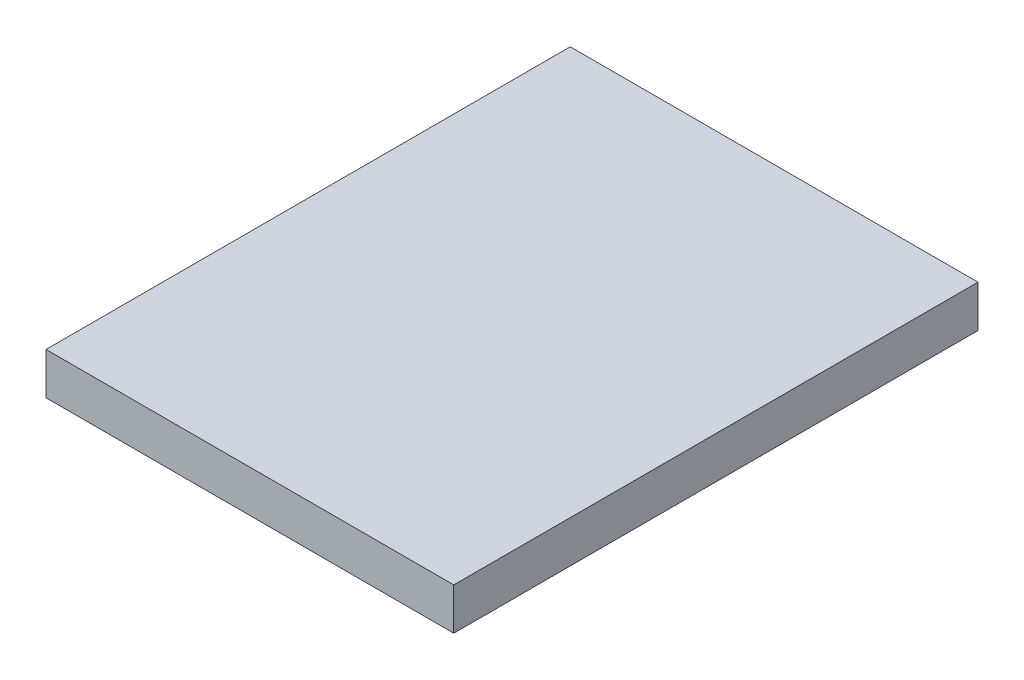
ISO-10303-21;
HEADER;
FILE_DESCRIPTION(('STEP AP214'),'2;1');
FILE_NAME('part.step','',(''),(''),'','','');
FILE_SCHEMA(('AUTOMOTIVE_DESIGN { 1 0 10303 214 1 1 1 1 }'));
ENDSEC;
DATA;
#1=APPLICATION_CONTEXT('core data for automotive mechanical design processes');
#2=APPLICATION_PROTOCOL_DEFINITION('international standard','automotive_design',2000,#1);
#3=PRODUCT_CONTEXT('',#1,'mechanical');
#4=PRODUCT('Part','Part','',(#3));
#5=PRODUCT_RELATED_PRODUCT_CATEGORY('part','',(#4));
#6=PRODUCT_DEFINITION_FORMATION('','',#4);
#7=PRODUCT_DEFINITION_CONTEXT('part definition',#1,'design');
#8=PRODUCT_DEFINITION('design','',#6,#7);
#9=PRODUCT_DEFINITION_SHAPE('','',#8);
#10=(LENGTH_UNIT() NAMED_UNIT(*) SI_UNIT(.MILLI.,.METRE.));
#11=(NAMED_UNIT(*) PLANE_ANGLE_UNIT() SI_UNIT($,.RADIAN.));
#12=(NAMED_UNIT(*) SI_UNIT($,.STERADIAN.) SOLID_ANGLE_UNIT());
#13=UNCERTAINTY_MEASURE_WITH_UNIT(LENGTH_MEASURE(1.E-05),#10,'distance_accuracy_value','');
#14=(GEOMETRIC_REPRESENTATION_CONTEXT(3) GLOBAL_UNCERTAINTY_ASSIGNED_CONTEXT((#13)) GLOBAL_UNIT_ASSIGNED_CONTEXT((#10,
#11,#12)) REPRESENTATION_CONTEXT('',''));
#15=CARTESIAN_POINT('',(0.,0.,0.));
#16=DIRECTION('',(0.,0.,1.));
#17=DIRECTION('',(1.,0.,0.));
#18=AXIS2_PLACEMENT_3D('',#15,#16,#17);
#19=CARTESIAN_POINT('',(-88.9,18.25625,-228.6));
#20=DIRECTION('',(1.,0.,0.));
#21=DIRECTION('',(0.,0.,-1.));
#22=AXIS2_PLACEMENT_3D('',#19,#20,#21);
#23=PLANE('',#22);
#24=DIRECTION('',(0.,0.,1.));
#25=VECTOR('',#24,1.);
#26=CARTESIAN_POINT('',(-88.9,0.,-228.6));
#27=LINE('',#26,#25);
#28=CARTESIAN_POINT('',(-88.9,0.,-228.6));
#29=VERTEX_POINT('',#28);
#30=CARTESIAN_POINT('',(-88.9,0.,0.));
#31=VERTEX_POINT('',#30);
#32=EDGE_CURVE('E96',#29,#31,#27,.T.);
#33=ORIENTED_EDGE('',*,*,#32,.T.);
#34=DIRECTION('',(0.,-1.,0.));
#35=VECTOR('',#34,1.);
#36=CARTESIAN_POINT('',(-88.9,18.25625,0.));
#37=LINE('',#36,#35);
#38=CARTESIAN_POINT('',(-88.9,18.25625,0.));
#39=VERTEX_POINT('',#38);
#40=EDGE_CURVE('E11',#39,#31,#37,.T.);
#41=ORIENTED_EDGE('',*,*,#40,.F.);
#42=DIRECTION('',(0.,0.,1.));
#43=VECTOR('',#42,1.);
#44=CARTESIAN_POINT('',(-88.9,18.25625,-228.6));
#45=LINE('',#44,#43);
#46=CARTESIAN_POINT('',(-88.9,18.25625,-228.6));
#47=VERTEX_POINT('',#46);
#48=EDGE_CURVE('E84',#47,#39,#45,.T.);
#49=ORIENTED_EDGE('',*,*,#48,.F.);
#50=DIRECTION('',(0.,-1.,0.));
#51=VECTOR('',#50,1.);
#52=CARTESIAN_POINT('',(-88.9,18.25625,-228.6));
#53=LINE('',#52,#51);
#54=EDGE_CURVE('E92',#47,#29,#53,.T.);
#55=ORIENTED_EDGE('',*,*,#54,.T.);
#56=EDGE_LOOP('',(#33,#41,#49,#55));
#57=FACE_BOUND('',#56,.T.);
#58=ADVANCED_FACE('F33',(#57),#23,.F.);
#59=CARTESIAN_POINT('',(-88.9,18.25625,0.));
#60=DIRECTION('',(0.,0.,-1.));
#61=DIRECTION('',(-1.,0.,0.));
#62=AXIS2_PLACEMENT_3D('',#59,#60,#61);
#63=PLANE('',#62);
#64=DIRECTION('',(1.,0.,0.));
#65=VECTOR('',#64,1.);
#66=CARTESIAN_POINT('',(-88.9,0.,0.));
#67=LINE('',#66,#65);
#68=CARTESIAN_POINT('',(88.9,0.,0.));
#69=VERTEX_POINT('',#68);
#70=EDGE_CURVE('E88',#31,#69,#67,.T.);
#71=ORIENTED_EDGE('',*,*,#70,.T.);
#72=DIRECTION('',(0.,-1.,0.));
#73=VECTOR('',#72,1.);
#74=CARTESIAN_POINT('',(88.9,18.25625,0.));
#75=LINE('',#74,#73);
#76=CARTESIAN_POINT('',(88.9,18.25625,0.));
#77=VERTEX_POINT('',#76);
#78=EDGE_CURVE('E41',#77,#69,#75,.T.);
#79=ORIENTED_EDGE('',*,*,#78,.F.);
#80=DIRECTION('',(1.,0.,0.));
#81=VECTOR('',#80,1.);
#82=CARTESIAN_POINT('',(-88.9,18.25625,0.));
#83=LINE('',#82,#81);
#84=EDGE_CURVE('E79',#39,#77,#83,.T.);
#85=ORIENTED_EDGE('',*,*,#84,.F.);
#86=ORIENTED_EDGE('',*,*,#40,.T.);
#87=EDGE_LOOP('',(#71,#79,#85,#86));
#88=FACE_BOUND('',#87,.T.);
#89=ADVANCED_FACE('F87',(#88),#63,.F.);
#90=CARTESIAN_POINT('',(88.8999999999999,18.25625,-228.6));
#91=DIRECTION('',(-1.,0.,0.));
#92=DIRECTION('',(0.,0.,1.));
#93=AXIS2_PLACEMENT_3D('',#90,#91,#92);
#94=PLANE('',#93);
#95=DIRECTION('',(0.,0.,-1.));
#96=VECTOR('',#95,1.);
#97=CARTESIAN_POINT('',(88.8999999999999,0.,-228.6));
#98=LINE('',#97,#96);
#99=CARTESIAN_POINT('',(88.8999999999999,0.,-228.6));
#100=VERTEX_POINT('',#99);
#101=EDGE_CURVE('E66',#69,#100,#98,.T.);
#102=ORIENTED_EDGE('',*,*,#101,.T.);
#103=DIRECTION('',(0.,-1.,0.));
#104=VECTOR('',#103,1.);
#105=CARTESIAN_POINT('',(88.8999999999999,18.25625,-228.6));
#106=LINE('',#105,#104);
#107=CARTESIAN_POINT('',(88.8999999999999,18.25625,-228.6));
#108=VERTEX_POINT('',#107);
#109=EDGE_CURVE('E89',#108,#100,#106,.T.);
#110=ORIENTED_EDGE('',*,*,#109,.F.);
#111=DIRECTION('',(0.,0.,-1.));
#112=VECTOR('',#111,1.);
#113=CARTESIAN_POINT('',(88.8999999999999,18.25625,-228.6));
#114=LINE('',#113,#112);
#115=EDGE_CURVE('E82',#77,#108,#114,.T.);
#116=ORIENTED_EDGE('',*,*,#115,.F.);
#117=ORIENTED_EDGE('',*,*,#78,.T.);
#118=EDGE_LOOP('',(#102,#110,#116,#117));
#119=FACE_BOUND('',#118,.T.);
#120=ADVANCED_FACE('F90',(#119),#94,.F.);
#121=CARTESIAN_POINT('',(-88.9,18.25625,-228.6));
#122=DIRECTION('',(0.,0.,1.));
#123=DIRECTION('',(1.,0.,0.));
#124=AXIS2_PLACEMENT_3D('',#121,#122,#123);
#125=PLANE('',#124);
#126=DIRECTION('',(-1.,0.,0.));
#127=VECTOR('',#126,1.);
#128=CARTESIAN_POINT('',(-88.9,0.,-228.6));
#129=LINE('',#128,#127);
#130=EDGE_CURVE('E72',#100,#29,#129,.T.);
#131=ORIENTED_EDGE('',*,*,#130,.T.);
#132=ORIENTED_EDGE('',*,*,#54,.F.);
#133=DIRECTION('',(-1.,0.,0.));
#134=VECTOR('',#133,1.);
#135=CARTESIAN_POINT('',(-88.9,18.25625,-228.6));
#136=LINE('',#135,#134);
#137=EDGE_CURVE('E49',#108,#47,#136,.T.);
#138=ORIENTED_EDGE('',*,*,#137,.F.);
#139=ORIENTED_EDGE('',*,*,#109,.T.);
#140=EDGE_LOOP('',(#131,#132,#138,#139));
#141=FACE_BOUND('',#140,.T.);
#142=ADVANCED_FACE('F103',(#141),#125,.F.);
#143=CARTESIAN_POINT('',(0.,18.25625,0.));
#144=DIRECTION('',(0.,1.,0.));
#145=DIRECTION('',(0.,0.,1.));
#146=AXIS2_PLACEMENT_3D('',#143,#144,#145);
#147=PLANE('',#146);
#148=ORIENTED_EDGE('',*,*,#48,.T.);
#149=ORIENTED_EDGE('',*,*,#84,.T.);
#150=ORIENTED_EDGE('',*,*,#115,.T.);
#151=ORIENTED_EDGE('',*,*,#137,.T.);
#152=EDGE_LOOP('',(#148,#149,#150,#151));
#153=FACE_BOUND('',#152,.T.);
#154=ADVANCED_FACE('F80',(#153),#147,.T.);
#155=CARTESIAN_POINT('',(0.,0.,0.));
#156=DIRECTION('',(0.,1.,0.));
#157=DIRECTION('',(0.,0.,1.));
#158=AXIS2_PLACEMENT_3D('',#155,#156,#157);
#159=PLANE('',#158);
#160=ORIENTED_EDGE('',*,*,#32,.F.);
#161=ORIENTED_EDGE('',*,*,#130,.F.);
#162=ORIENTED_EDGE('',*,*,#101,.F.);
#163=ORIENTED_EDGE('',*,*,#70,.F.);
#164=EDGE_LOOP('',(#160,#161,#162,#163));
#165=FACE_BOUND('',#164,.T.);
#166=ADVANCED_FACE('F106',(#165),#159,.F.);
#167=CLOSED_SHELL('',(#58,#89,#120,#142,#154,#166));
#168=MANIFOLD_SOLID_BREP('B2',#167);
#169=ADVANCED_BREP_SHAPE_REPRESENTATION('',(#18,#168),#14);
#170=SHAPE_DEFINITION_REPRESENTATION(#9,#169);
ENDSEC;
END-ISO-10303-21;
